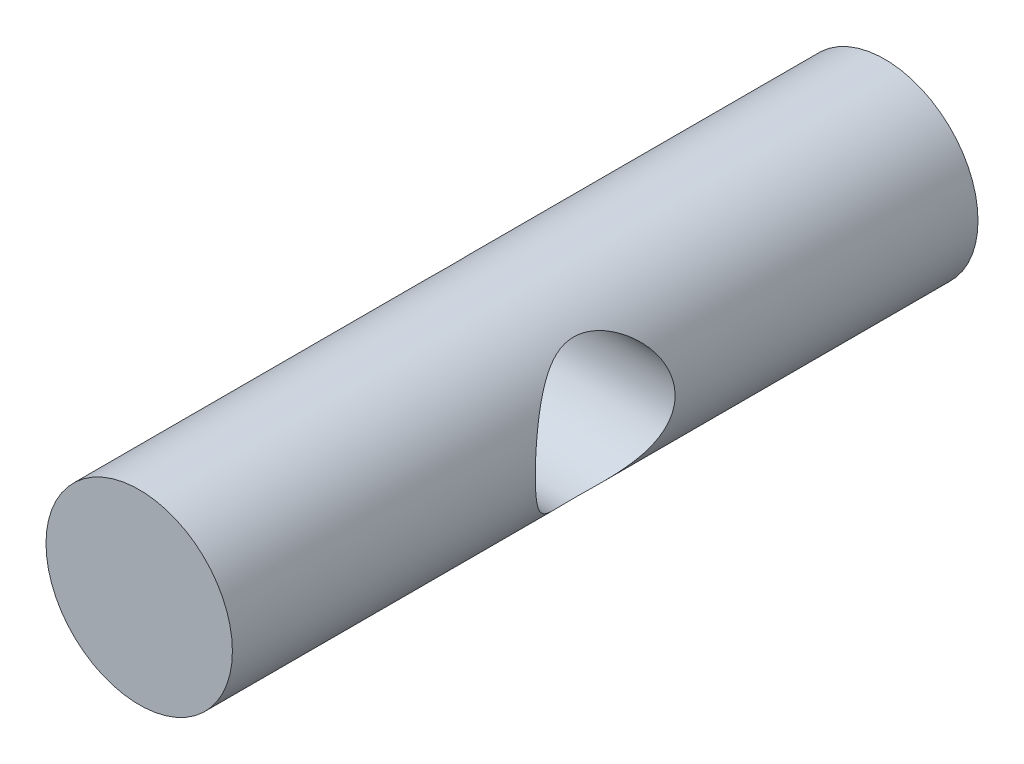
ISO-10303-21;
HEADER;
FILE_DESCRIPTION(('STEP AP214'),'2;1');
FILE_NAME('part.step','',(''),(''),'','','');
FILE_SCHEMA(('AUTOMOTIVE_DESIGN { 1 0 10303 214 1 1 1 1 }'));
ENDSEC;
DATA;
#1=APPLICATION_CONTEXT('core data for automotive mechanical design processes');
#2=APPLICATION_PROTOCOL_DEFINITION('international standard','automotive_design',2000,#1);
#3=PRODUCT_CONTEXT('',#1,'mechanical');
#4=PRODUCT('Part','Part','',(#3));
#5=PRODUCT_RELATED_PRODUCT_CATEGORY('part','',(#4));
#6=PRODUCT_DEFINITION_FORMATION('','',#4);
#7=PRODUCT_DEFINITION_CONTEXT('part definition',#1,'design');
#8=PRODUCT_DEFINITION('design','',#6,#7);
#9=PRODUCT_DEFINITION_SHAPE('','',#8);
#10=(LENGTH_UNIT() NAMED_UNIT(*) SI_UNIT(.MILLI.,.METRE.));
#11=(NAMED_UNIT(*) PLANE_ANGLE_UNIT() SI_UNIT($,.RADIAN.));
#12=(NAMED_UNIT(*) SI_UNIT($,.STERADIAN.) SOLID_ANGLE_UNIT());
#13=UNCERTAINTY_MEASURE_WITH_UNIT(LENGTH_MEASURE(1.E-05),#10,'distance_accuracy_value','');
#14=(GEOMETRIC_REPRESENTATION_CONTEXT(3) GLOBAL_UNCERTAINTY_ASSIGNED_CONTEXT((#13)) GLOBAL_UNIT_ASSIGNED_CONTEXT((#10,
#11,#12)) REPRESENTATION_CONTEXT('',''));
#15=CARTESIAN_POINT('',(0.,0.,0.));
#16=DIRECTION('',(0.,0.,1.));
#17=DIRECTION('',(1.,0.,0.));
#18=AXIS2_PLACEMENT_3D('',#15,#16,#17);
#19=CARTESIAN_POINT('',(0.,0.,80.));
#20=DIRECTION('',(0.,0.,-1.));
#21=DIRECTION('',(-1.,0.,0.));
#22=AXIS2_PLACEMENT_3D('',#19,#20,#21);
#23=CYLINDRICAL_SURFACE('',#22,10.);
#24=CARTESIAN_POINT('',(0.,0.,80.));
#25=DIRECTION('',(0.,0.,1.));
#26=DIRECTION('',(1.,0.,0.));
#27=AXIS2_PLACEMENT_3D('',#24,#25,#26);
#28=CIRCLE('',#27,10.);
#29=CARTESIAN_POINT('',(10.,0.,80.));
#30=VERTEX_POINT('',#29);
#31=EDGE_CURVE('E10',#30,#30,#28,.T.);
#32=ORIENTED_EDGE('',*,*,#31,.F.);
#33=EDGE_LOOP('',(#32));
#34=FACE_BOUND('',#33,.T.);
#35=CARTESIAN_POINT('',(0.,0.,0.));
#36=DIRECTION('',(0.,0.,1.));
#37=DIRECTION('',(1.,0.,0.));
#38=AXIS2_PLACEMENT_3D('',#35,#36,#37);
#39=CIRCLE('',#38,10.);
#40=CARTESIAN_POINT('',(10.,0.,0.));
#41=VERTEX_POINT('',#40);
#42=EDGE_CURVE('E49',#41,#41,#39,.T.);
#43=ORIENTED_EDGE('',*,*,#42,.T.);
#44=EDGE_LOOP('',(#43));
#45=FACE_BOUND('',#44,.T.);
#46=CARTESIAN_POINT('',(10.,0.,47.5));
#47=CARTESIAN_POINT('',(9.99999825220043,-0.183148360631224,47.4999981889374));
#48=CARTESIAN_POINT('',(9.99495621731441,-0.366342585140464,47.4932790435537));
#49=CARTESIAN_POINT('',(9.97490143097507,-0.731284647804647,47.4665075354722));
#50=CARTESIAN_POINT('',(9.95988271339075,-0.913031554599345,47.4464471946312));
#51=CARTESIAN_POINT('',(9.9201917868147,-1.27389276294165,47.3932752466979));
#52=CARTESIAN_POINT('',(9.89550118322144,-1.45300136929127,47.3601387696951));
#53=CARTESIAN_POINT('',(9.83702172640045,-1.8069893726824,47.2813249678357));
#54=CARTESIAN_POINT('',(9.80322881221236,-1.98186684397495,47.2356420452522));
#55=CARTESIAN_POINT('',(9.72752378128582,-2.32506995293138,47.1327363216916));
#56=CARTESIAN_POINT('',(9.6856665671512,-2.49343113760904,47.0755914524838));
#57=CARTESIAN_POINT('',(9.59451489400363,-2.82395570771372,46.9502916629176));
#58=CARTESIAN_POINT('',(9.5452174929203,-2.98611660943024,46.8821323863789));
#59=CARTESIAN_POINT('',(9.38756843011347,-3.46192400316672,46.6623521329774));
#60=CARTESIAN_POINT('',(9.26935773011459,-3.76534217699647,46.4952921574436));
#61=CARTESIAN_POINT('',(9.00247083181558,-4.36738031046614,46.1086707071509));
#62=CARTESIAN_POINT('',(8.85198712189838,-4.66295396944976,45.885680005089));
#63=CARTESIAN_POINT('',(8.53832916588274,-5.21514803427101,45.4025041354839));
#64=CARTESIAN_POINT('',(8.37513550772825,-5.47170701559805,45.1422615438788));
#65=CARTESIAN_POINT('',(8.1123054849366,-5.84983236323795,44.6986607517648));
#66=CARTESIAN_POINT('',(8.01322272061777,-5.98448699541009,44.5259238219425));
#67=CARTESIAN_POINT('',(7.81692237304354,-6.23870842573754,44.1685280702438));
#68=CARTESIAN_POINT('',(7.71970535968098,-6.35827067422418,43.9838656786204));
#69=CARTESIAN_POINT('',(7.53024443396407,-6.58155279088788,43.603028862686));
#70=CARTESIAN_POINT('',(7.43799561146134,-6.68528849377295,43.4068662202847));
#71=CARTESIAN_POINT('',(7.26194992595442,-6.87611265864527,43.0031570820878));
#72=CARTESIAN_POINT('',(7.17814826410122,-6.96321059804277,42.7956171544029));
#73=CARTESIAN_POINT('',(6.99885956719935,-7.14400878104046,42.3025464523882));
#74=CARTESIAN_POINT('',(6.9078729915952,-7.23130376139035,42.0128709819946));
#75=CARTESIAN_POINT('',(6.79582705692467,-7.33616747091051,41.5665302760464));
#76=CARTESIAN_POINT('',(6.7625626495277,-7.36676563602348,41.4158673133472));
#77=CARTESIAN_POINT('',(6.70541097180997,-7.41882486802788,41.1112483315377));
#78=CARTESIAN_POINT('',(6.68151886959137,-7.44029064361234,40.9572940525537));
#79=CARTESIAN_POINT('',(6.64399487351841,-7.4738195774795,40.6456153273307));
#80=CARTESIAN_POINT('',(6.63046224230684,-7.48579180837431,40.4878689878931));
#81=CARTESIAN_POINT('',(6.61471013710175,-7.49971481213819,40.1713664228761));
#82=CARTESIAN_POINT('',(6.61249035269244,-7.50166585998078,40.0126102251262));
#83=CARTESIAN_POINT('',(6.61948621008001,-7.49549374588534,39.6954929541917));
#84=CARTESIAN_POINT('',(6.62870559451458,-7.48736728681514,39.5371320273203));
#85=CARTESIAN_POINT('',(6.65809333447629,-7.46124382754021,39.2222932055966));
#86=CARTESIAN_POINT('',(6.6782618015552,-7.44324672677111,39.065815329946));
#87=CARTESIAN_POINT('',(6.74840995476556,-7.37988631197293,38.6342503129904));
#88=CARTESIAN_POINT('',(6.80936438102532,-7.32413018954155,38.3623944329782));
#89=CARTESIAN_POINT('',(6.95570310792852,-7.18527767988214,37.8327292447162));
#90=CARTESIAN_POINT('',(7.04111087930064,-7.10215501424415,37.5749337161969));
#91=CARTESIAN_POINT('',(7.21099153900677,-6.92917382263755,37.1218305167386));
#92=CARTESIAN_POINT('',(7.29266351327928,-6.84346833605325,36.9238405761359));
#93=CARTESIAN_POINT('',(7.46342165901279,-6.65682611972849,36.5384190168799));
#94=CARTESIAN_POINT('',(7.55251162228971,-6.55588157861578,36.3509928811768));
#95=CARTESIAN_POINT('',(7.73517823120313,-6.33933222593356,35.9865361640151));
#96=CARTESIAN_POINT('',(7.82876380678446,-6.22369741624747,35.8095279702705));
#97=CARTESIAN_POINT('',(8.01761553681547,-5.97844426893635,35.4664971158473));
#98=CARTESIAN_POINT('',(8.11288142581883,-5.84882812374302,35.3004727393501));
#99=CARTESIAN_POINT('',(8.30521453319946,-5.57247402890015,34.975645048084));
#100=CARTESIAN_POINT('',(8.40226649936021,-5.42538639972571,34.8171299047616));
#101=CARTESIAN_POINT('',(8.5935031315706,-5.11709028531975,34.5125287068656));
#102=CARTESIAN_POINT('',(8.68768750660852,-4.95588037331081,34.3664439110788));
#103=CARTESIAN_POINT('',(8.87089324795422,-4.61993509999966,34.0878314184192));
#104=CARTESIAN_POINT('',(8.9599230830712,-4.44522309293499,33.9552811940493));
#105=CARTESIAN_POINT('',(9.13090472642982,-4.0824934348789,33.7046195018473));
#106=CARTESIAN_POINT('',(9.21285834099645,-3.89447920193418,33.5865043460028));
#107=CARTESIAN_POINT('',(9.35211813533671,-3.54483535127364,33.3881893774522));
#108=CARTESIAN_POINT('',(9.41107137526017,-3.3854749988014,33.3051360212074));
#109=CARTESIAN_POINT('',(9.52211460031246,-3.05924910859919,33.1499191215818));
#110=CARTESIAN_POINT('',(9.57420599638373,-2.89238512327235,33.0777533390372));
#111=CARTESIAN_POINT('',(9.67052015896568,-2.55192522953366,32.9451409236695));
#112=CARTESIAN_POINT('',(9.71474587063951,-2.37833187059298,32.8846899037026));
#113=CARTESIAN_POINT('',(9.7944303324846,-2.02530797337889,32.7762740016175));
#114=CARTESIAN_POINT('',(9.82988897006303,-1.84587736017292,32.7283092798566));
#115=CARTESIAN_POINT('',(9.89142668215868,-1.48124003999791,32.6453346771726));
#116=CARTESIAN_POINT('',(9.91744578882848,-1.29600425567115,32.6104075830867));
#117=CARTESIAN_POINT('',(9.95915423278582,-0.922276966538736,32.554524893669));
#118=CARTESIAN_POINT('',(9.97484354492046,-0.733785453806579,32.5335693323576));
#119=CARTESIAN_POINT('',(9.99548555303477,-0.355230498112978,32.5060147552589));
#120=CARTESIAN_POINT('',(10.0004418293711,-0.165167600582664,32.4994109519686));
#121=CARTESIAN_POINT('',(9.99949640206274,0.214874139571324,32.5006714062232));
#122=CARTESIAN_POINT('',(9.99359555401241,0.40485298763842,32.5085345237041));
#123=CARTESIAN_POINT('',(9.97223305994797,0.763928127056929,32.5370576302621));
#124=CARTESIAN_POINT('',(9.95779618888371,0.933197305435492,32.5563463419927));
#125=CARTESIAN_POINT('',(9.92057133553495,1.26918880187072,32.606218049516));
#126=CARTESIAN_POINT('',(9.89778056893783,1.43591025146062,32.6368048109199));
#127=CARTESIAN_POINT('',(9.84430767733922,1.76564432096826,32.7088426505787));
#128=CARTESIAN_POINT('',(9.81362747999547,1.92865783628606,32.7502910750048));
#129=CARTESIAN_POINT('',(9.74493618777163,2.2501682264863,32.8435500772852));
#130=CARTESIAN_POINT('',(9.70692222377835,2.40866330572277,32.8953647108982));
#131=CARTESIAN_POINT('',(9.62279034107677,2.72575422161848,33.0107433563643));
#132=CARTESIAN_POINT('',(9.57643622072002,2.88416117889077,33.0746538258923));
#133=CARTESIAN_POINT('',(9.47738924248976,3.19463271777295,33.2122770509072));
#134=CARTESIAN_POINT('',(9.42469423001767,3.34669511976836,33.285993139189));
#135=CARTESIAN_POINT('',(9.25839398463923,3.79243668836606,33.5207930758232));
#136=CARTESIAN_POINT('',(9.13650809547068,4.07590942242921,33.6956169701555));
#137=CARTESIAN_POINT('',(8.855926898612,4.65763303463208,34.1089611242663));
#138=CARTESIAN_POINT('',(8.69448369509785,4.95044606090117,34.3532430155336));
#139=CARTESIAN_POINT('',(8.44516881462102,5.35767107336567,34.7482147034281));
#140=CARTESIAN_POINT('',(8.36074234741944,5.4882491820926,34.8848527858376));
#141=CARTESIAN_POINT('',(8.19100904652955,5.7384834596805,35.1672592877294));
#142=CARTESIAN_POINT('',(8.1057024263051,5.85814221058998,35.3130255348992));
#143=CARTESIAN_POINT('',(7.91961196391862,6.1080614484982,35.6420163996148));
#144=CARTESIAN_POINT('',(7.81897317293293,6.23600392340882,35.8270894234011));
#145=CARTESIAN_POINT('',(7.62168627596285,6.47564568677309,36.2096220476519));
#146=CARTESIAN_POINT('',(7.52503964549598,6.58733900727103,36.4070861611693));
#147=CARTESIAN_POINT('',(7.33958950470875,6.79334858159908,36.8137398557131));
#148=CARTESIAN_POINT('',(7.25076782174859,6.88770568215121,37.0229003198852));
#149=CARTESIAN_POINT('',(7.08503810393456,7.05807032553021,37.453031280932));
#150=CARTESIAN_POINT('',(7.00812021113291,7.13409308112477,37.6739917995539));
#151=CARTESIAN_POINT('',(6.89776536900087,7.24045739920368,38.0387365799028));
#152=CARTESIAN_POINT('',(6.85905105065738,7.27706722475707,38.179121350578));
#153=CARTESIAN_POINT('',(6.78909215619301,7.34237828490353,38.4635265676929));
#154=CARTESIAN_POINT('',(6.75784495867727,7.37108229544015,38.607545718565));
#155=CARTESIAN_POINT('',(6.70397772845789,7.42010866141178,38.8983271464417));
#156=CARTESIAN_POINT('',(6.68134175721603,7.4404465075322,39.0450838229389));
#157=CARTESIAN_POINT('',(6.64553659947693,7.47244433482206,39.3407022122691));
#158=CARTESIAN_POINT('',(6.63236743689916,7.48410429406539,39.48956393042));
#159=CARTESIAN_POINT('',(6.61604392687071,7.49853887636308,39.7890456134731));
#160=CARTESIAN_POINT('',(6.61294157310429,7.5012673702604,39.939670686664));
#161=CARTESIAN_POINT('',(6.61704410383111,7.49764855771467,40.2406650710012));
#162=CARTESIAN_POINT('',(6.6242487717127,7.491301442004,40.3910343874559));
#163=CARTESIAN_POINT('',(6.64864042221955,7.46966150960367,40.69044033884));
#164=CARTESIAN_POINT('',(6.66583653866429,7.45436050750457,40.8394756274997));
#165=CARTESIAN_POINT('',(6.70947271822503,7.41510828933917,41.1350870372553));
#166=CARTESIAN_POINT('',(6.73591768435148,7.39115248495673,41.281661810703));
#167=CARTESIAN_POINT('',(6.80366991769713,7.32888993758964,41.6030185630502));
#168=CARTESIAN_POINT('',(6.84695911424574,7.28859466709028,41.7769975614515));
#169=CARTESIAN_POINT('',(6.94360749633832,7.19657956576836,42.1191194152513));
#170=CARTESIAN_POINT('',(6.99697427787176,7.14485111212704,42.2872577543234));
#171=CARTESIAN_POINT('',(7.11173285585202,7.03063417120002,42.6173948444318));
#172=CARTESIAN_POINT('',(7.17314049085418,6.96812436806886,42.7793806420008));
#173=CARTESIAN_POINT('',(7.30189696957416,6.83308175773697,43.0965626417457));
#174=CARTESIAN_POINT('',(7.36924400073342,6.76055200457875,43.2517608938347));
#175=CARTESIAN_POINT('',(7.53227527340475,6.57908862155702,43.6080855923601));
#176=CARTESIAN_POINT('',(7.62967949604614,6.46625899136203,43.8064489596901));
#177=CARTESIAN_POINT('',(7.82848797542238,6.22409397674893,44.1907343917703));
#178=CARTESIAN_POINT('',(7.92989347166993,6.09475344941422,44.3766525523867));
#179=CARTESIAN_POINT('',(8.13368678615596,5.82000166017292,44.7358998175134));
#180=CARTESIAN_POINT('',(8.23607528693575,5.67457836362909,44.9092193316068));
#181=CARTESIAN_POINT('',(8.43902615179917,5.36811116429771,45.2425789323651));
#182=CARTESIAN_POINT('',(8.53958873605844,5.20706915992245,45.4026206285367));
#183=CARTESIAN_POINT('',(8.73722404742755,4.86823444610667,45.7099065721763));
#184=CARTESIAN_POINT('',(8.83426032912376,4.69031229919782,45.8570319241357));
#185=CARTESIAN_POINT('',(9.02148209885813,4.31926384766125,46.1357799917969));
#186=CARTESIAN_POINT('',(9.11166669061666,4.12613556060168,46.2674006805464));
#187=CARTESIAN_POINT('',(9.28256253574139,3.72576429558787,46.5133531652643));
#188=CARTESIAN_POINT('',(9.36329167565035,3.51854917893226,46.6277177262155));
#189=CARTESIAN_POINT('',(9.51304471510834,3.09083237545736,46.8376480517731));
#190=CARTESIAN_POINT('',(9.5820746530538,2.87033762289902,46.9332235182347));
#191=CARTESIAN_POINT('',(9.68796526126722,2.48412405824608,47.0787264227465));
#192=CARTESIAN_POINT('',(9.72832482945904,2.32129005811085,47.1338229914882));
#193=CARTESIAN_POINT('',(9.80132549603498,1.99064201184581,47.2330570398299));
#194=CARTESIAN_POINT('',(9.83396846856479,1.82282918610054,47.277197180571));
#195=CARTESIAN_POINT('',(9.89082818213226,1.48358839494541,47.3538520954768));
#196=CARTESIAN_POINT('',(9.91506439962452,1.31216977477247,47.3863937454765));
#197=CARTESIAN_POINT('',(9.95469855719796,0.96654040133809,47.4395119589965));
#198=CARTESIAN_POINT('',(9.9701010169854,0.792331122875274,47.4600946412769));
#199=CARTESIAN_POINT('',(9.98726751877774,0.514835906933095,47.483016801583));
#200=CARTESIAN_POINT('',(9.99203792739739,0.412044960462383,47.4893811518671));
#201=CARTESIAN_POINT('',(9.9984049153868,0.206174215981064,47.4978736017728));
#202=CARTESIAN_POINT('',(10.0000009838379,0.103094374145228,47.5000010194487));
#203=CARTESIAN_POINT('',(10.,0.,47.5));
#204=B_SPLINE_CURVE_WITH_KNOTS('',3,(#46,#47,#48,#49,#50,#51,#52,#53,#54,#55,#56,#57,#58,#59,
#60,#61,#62,#63,#64,#65,#66,#67,#68,#69,#70,#71,#72,#73,#74,#75,#76,#77,#78,#79,#80,#81,#82,#83,
#84,#85,#86,#87,#88,#89,#90,#91,#92,#93,#94,#95,#96,#97,#98,#99,#100,#101,#102,#103,#104,#105,
#106,#107,#108,#109,#110,#111,#112,#113,#114,#115,#116,#117,#118,#119,#120,#121,#122,#123,#124,
#125,#126,#127,#128,#129,#130,#131,#132,#133,#134,#135,#136,#137,#138,#139,#140,#141,#142,#143,
#144,#145,#146,#147,#148,#149,#150,#151,#152,#153,#154,#155,#156,#157,#158,#159,#160,#161,#162,
#163,#164,#165,#166,#167,#168,#169,#170,#171,#172,#173,#174,#175,#176,#177,#178,#179,#180,#181,
#182,#183,#184,#185,#186,#187,#188,#189,#190,#191,#192,#193,#194,#195,#196,#197,#198,#199,#200,
#201,#202,#203),.UNSPECIFIED.,.T.,.F.,(4,2,2,2,2,2,2,2,2,2,2,2,2,2,2,2,2,2,2,2,2,2,2,2,2,2,2,2,
2,2,2,2,2,2,2,2,2,2,2,2,2,2,2,2,2,2,2,2,2,2,2,2,2,2,2,2,2,2,2,2,2,2,2,2,2,2,2,2,2,2,2,2,2,2,2,2,
2,2,4),(0.,0.549333810396349,1.09899642261334,1.64970953325451,2.20066875053375,
2.74800168216963,3.29555161528971,4.38923194166926,5.58419151329428,6.78101336768092,
7.50152042078937,8.22224415798695,8.94224200290019,9.66182848258839,10.6057257062582,
11.0771415311411,11.5483139968762,12.0239465220089,12.4995659960823,12.9753411231469,
13.4511210976087,14.3000658907337,15.1498282626302,15.8409837223713,16.5324946713612,
17.2254411215001,17.9182790673241,18.6286106705283,19.3390141216436,20.0482151836289,
20.7572346715093,21.3240789510858,21.8908064927599,22.4573213847599,23.0238435519584,
23.5939042031105,24.163966242347,24.733838089351,25.3036650295946,25.8159956353881,
26.3284971539712,26.8408735696906,27.3534508450853,27.8838865184232,28.4145029424249,
29.4749536671179,30.7125000722884,31.3331067040452,31.9535662015579,32.6921380168985,
33.4309804122227,34.168059012369,34.9045239072426,35.3546199278826,35.804557705681,
36.2536585931601,36.7027606153632,37.1541785263257,37.6055869504596,38.0574086864992,
38.5094703067445,39.0599080061886,39.6107622667341,40.1627183763172,40.7145066214401,
41.457880510944,42.2014865187519,42.9456527762346,43.6897286953817,44.440059867972,
45.1904890240893,45.9394748739468,46.6880729590086,47.2172824489513,47.7463632763238,
48.2742100312628,48.801786477061,49.1109572068325,49.4201776944439),.UNSPECIFIED.);
#205=CARTESIAN_POINT('',(10.,0.,47.5));
#206=VERTEX_POINT('',#205);
#207=EDGE_CURVE('E55',#206,#206,#204,.T.);
#208=ORIENTED_EDGE('',*,*,#207,.F.);
#209=EDGE_LOOP('',(#208));
#210=FACE_BOUND('',#209,.T.);
#211=CARTESIAN_POINT('',(-10.,0.,47.5));
#212=CARTESIAN_POINT('',(-9.99999825220043,0.183148360631224,47.4999981889374));
#213=CARTESIAN_POINT('',(-9.99495621731441,0.366342585140464,47.4932790435537));
#214=CARTESIAN_POINT('',(-9.97490143097507,0.731284647804647,47.4665075354722));
#215=CARTESIAN_POINT('',(-9.95988271339075,0.913031554599345,47.4464471946312));
#216=CARTESIAN_POINT('',(-9.9201917868147,1.27389276294165,47.3932752466979));
#217=CARTESIAN_POINT('',(-9.89550118322144,1.45300136929127,47.3601387696951));
#218=CARTESIAN_POINT('',(-9.83702172640045,1.8069893726824,47.2813249678357));
#219=CARTESIAN_POINT('',(-9.80322881221236,1.98186684397495,47.2356420452522));
#220=CARTESIAN_POINT('',(-9.72752378128582,2.32506995293138,47.1327363216916));
#221=CARTESIAN_POINT('',(-9.6856665671512,2.49343113760904,47.0755914524838));
#222=CARTESIAN_POINT('',(-9.59451489400363,2.82395570771372,46.9502916629176));
#223=CARTESIAN_POINT('',(-9.5452174929203,2.98611660943024,46.8821323863789));
#224=CARTESIAN_POINT('',(-9.38756843011347,3.46192400316672,46.6623521329774));
#225=CARTESIAN_POINT('',(-9.26935773011459,3.76534217699647,46.4952921574436));
#226=CARTESIAN_POINT('',(-9.00247083181558,4.36738031046614,46.1086707071509));
#227=CARTESIAN_POINT('',(-8.85198712189838,4.66295396944976,45.885680005089));
#228=CARTESIAN_POINT('',(-8.53832916588274,5.21514803427101,45.4025041354839));
#229=CARTESIAN_POINT('',(-8.37513550772825,5.47170701559805,45.1422615438788));
#230=CARTESIAN_POINT('',(-8.1123054849366,5.84983236323795,44.6986607517648));
#231=CARTESIAN_POINT('',(-8.01322272061777,5.98448699541009,44.5259238219425));
#232=CARTESIAN_POINT('',(-7.81692237304354,6.23870842573754,44.1685280702438));
#233=CARTESIAN_POINT('',(-7.71970535968098,6.35827067422418,43.9838656786204));
#234=CARTESIAN_POINT('',(-7.53024443396407,6.58155279088788,43.603028862686));
#235=CARTESIAN_POINT('',(-7.43799561146134,6.68528849377295,43.4068662202847));
#236=CARTESIAN_POINT('',(-7.26194992595442,6.87611265864527,43.0031570820878));
#237=CARTESIAN_POINT('',(-7.17814826410122,6.96321059804277,42.7956171544029));
#238=CARTESIAN_POINT('',(-6.99885956719935,7.14400878104046,42.3025464523882));
#239=CARTESIAN_POINT('',(-6.9078729915952,7.23130376139035,42.0128709819946));
#240=CARTESIAN_POINT('',(-6.79582705692467,7.33616747091051,41.5665302760464));
#241=CARTESIAN_POINT('',(-6.7625626495277,7.36676563602348,41.4158673133472));
#242=CARTESIAN_POINT('',(-6.70541097180997,7.41882486802788,41.1112483315377));
#243=CARTESIAN_POINT('',(-6.68151886959137,7.44029064361234,40.9572940525537));
#244=CARTESIAN_POINT('',(-6.64399487351841,7.4738195774795,40.6456153273307));
#245=CARTESIAN_POINT('',(-6.63046224230684,7.48579180837431,40.4878689878931));
#246=CARTESIAN_POINT('',(-6.61471013710175,7.49971481213819,40.1713664228761));
#247=CARTESIAN_POINT('',(-6.61249035269244,7.50166585998078,40.0126102251262));
#248=CARTESIAN_POINT('',(-6.61948621008001,7.49549374588534,39.6954929541917));
#249=CARTESIAN_POINT('',(-6.62870559451458,7.48736728681514,39.5371320273203));
#250=CARTESIAN_POINT('',(-6.65809333447629,7.46124382754021,39.2222932055966));
#251=CARTESIAN_POINT('',(-6.6782618015552,7.44324672677111,39.065815329946));
#252=CARTESIAN_POINT('',(-6.74840995476556,7.37988631197293,38.6342503129904));
#253=CARTESIAN_POINT('',(-6.80936438102532,7.32413018954155,38.3623944329782));
#254=CARTESIAN_POINT('',(-6.95570310792852,7.18527767988214,37.8327292447162));
#255=CARTESIAN_POINT('',(-7.04111087930064,7.10215501424415,37.5749337161969));
#256=CARTESIAN_POINT('',(-7.21099153900677,6.92917382263755,37.1218305167386));
#257=CARTESIAN_POINT('',(-7.29266351327928,6.84346833605325,36.9238405761359));
#258=CARTESIAN_POINT('',(-7.46342165901279,6.65682611972849,36.5384190168799));
#259=CARTESIAN_POINT('',(-7.55251162228971,6.55588157861578,36.3509928811768));
#260=CARTESIAN_POINT('',(-7.73517823120313,6.33933222593356,35.9865361640151));
#261=CARTESIAN_POINT('',(-7.82876380678446,6.22369741624747,35.8095279702705));
#262=CARTESIAN_POINT('',(-8.01761553681547,5.97844426893635,35.4664971158473));
#263=CARTESIAN_POINT('',(-8.11288142581883,5.84882812374302,35.3004727393501));
#264=CARTESIAN_POINT('',(-8.30521453319946,5.57247402890015,34.975645048084));
#265=CARTESIAN_POINT('',(-8.40226649936021,5.42538639972571,34.8171299047616));
#266=CARTESIAN_POINT('',(-8.5935031315706,5.11709028531975,34.5125287068656));
#267=CARTESIAN_POINT('',(-8.68768750660852,4.95588037331081,34.3664439110788));
#268=CARTESIAN_POINT('',(-8.87089324795422,4.61993509999966,34.0878314184192));
#269=CARTESIAN_POINT('',(-8.9599230830712,4.44522309293499,33.9552811940493));
#270=CARTESIAN_POINT('',(-9.13090472642982,4.0824934348789,33.7046195018473));
#271=CARTESIAN_POINT('',(-9.21285834099645,3.89447920193418,33.5865043460028));
#272=CARTESIAN_POINT('',(-9.35211813533671,3.54483535127364,33.3881893774522));
#273=CARTESIAN_POINT('',(-9.41107137526017,3.3854749988014,33.3051360212074));
#274=CARTESIAN_POINT('',(-9.52211460031246,3.05924910859919,33.1499191215818));
#275=CARTESIAN_POINT('',(-9.57420599638373,2.89238512327235,33.0777533390372));
#276=CARTESIAN_POINT('',(-9.67052015896568,2.55192522953366,32.9451409236695));
#277=CARTESIAN_POINT('',(-9.71474587063951,2.37833187059298,32.8846899037026));
#278=CARTESIAN_POINT('',(-9.7944303324846,2.02530797337889,32.7762740016175));
#279=CARTESIAN_POINT('',(-9.82988897006303,1.84587736017292,32.7283092798566));
#280=CARTESIAN_POINT('',(-9.89142668215868,1.48124003999791,32.6453346771726));
#281=CARTESIAN_POINT('',(-9.91744578882848,1.29600425567115,32.6104075830867));
#282=CARTESIAN_POINT('',(-9.95915423278582,0.922276966538736,32.554524893669));
#283=CARTESIAN_POINT('',(-9.97484354492046,0.733785453806579,32.5335693323576));
#284=CARTESIAN_POINT('',(-9.99548555303477,0.355230498112978,32.5060147552589));
#285=CARTESIAN_POINT('',(-10.0004418293711,0.165167600582664,32.4994109519686));
#286=CARTESIAN_POINT('',(-9.99949640206274,-0.214874139571324,32.5006714062232));
#287=CARTESIAN_POINT('',(-9.99359555401241,-0.40485298763842,32.5085345237041));
#288=CARTESIAN_POINT('',(-9.97223305994797,-0.763928127056929,32.5370576302621));
#289=CARTESIAN_POINT('',(-9.95779618888371,-0.933197305435492,32.5563463419927));
#290=CARTESIAN_POINT('',(-9.92057133553495,-1.26918880187072,32.606218049516));
#291=CARTESIAN_POINT('',(-9.89778056893783,-1.43591025146062,32.6368048109199));
#292=CARTESIAN_POINT('',(-9.84430767733922,-1.76564432096826,32.7088426505787));
#293=CARTESIAN_POINT('',(-9.81362747999547,-1.92865783628606,32.7502910750048));
#294=CARTESIAN_POINT('',(-9.74493618777163,-2.2501682264863,32.8435500772852));
#295=CARTESIAN_POINT('',(-9.70692222377835,-2.40866330572277,32.8953647108982));
#296=CARTESIAN_POINT('',(-9.62279034107677,-2.72575422161848,33.0107433563643));
#297=CARTESIAN_POINT('',(-9.57643622072002,-2.88416117889077,33.0746538258923));
#298=CARTESIAN_POINT('',(-9.47738924248976,-3.19463271777295,33.2122770509072));
#299=CARTESIAN_POINT('',(-9.42469423001767,-3.34669511976836,33.285993139189));
#300=CARTESIAN_POINT('',(-9.25839398463923,-3.79243668836606,33.5207930758232));
#301=CARTESIAN_POINT('',(-9.13650809547068,-4.07590942242921,33.6956169701555));
#302=CARTESIAN_POINT('',(-8.855926898612,-4.65763303463208,34.1089611242663));
#303=CARTESIAN_POINT('',(-8.69448369509785,-4.95044606090117,34.3532430155336));
#304=CARTESIAN_POINT('',(-8.44516881462102,-5.35767107336567,34.7482147034281));
#305=CARTESIAN_POINT('',(-8.36074234741944,-5.4882491820926,34.8848527858376));
#306=CARTESIAN_POINT('',(-8.19100904652955,-5.7384834596805,35.1672592877294));
#307=CARTESIAN_POINT('',(-8.1057024263051,-5.85814221058998,35.3130255348992));
#308=CARTESIAN_POINT('',(-7.91961196391862,-6.1080614484982,35.6420163996148));
#309=CARTESIAN_POINT('',(-7.81897317293293,-6.23600392340882,35.8270894234011));
#310=CARTESIAN_POINT('',(-7.62168627596285,-6.47564568677309,36.2096220476519));
#311=CARTESIAN_POINT('',(-7.52503964549598,-6.58733900727103,36.4070861611693));
#312=CARTESIAN_POINT('',(-7.33958950470875,-6.79334858159908,36.8137398557131));
#313=CARTESIAN_POINT('',(-7.25076782174859,-6.88770568215121,37.0229003198852));
#314=CARTESIAN_POINT('',(-7.08503810393456,-7.05807032553021,37.453031280932));
#315=CARTESIAN_POINT('',(-7.00812021113291,-7.13409308112477,37.6739917995539));
#316=CARTESIAN_POINT('',(-6.89776536900087,-7.24045739920368,38.0387365799028));
#317=CARTESIAN_POINT('',(-6.85905105065738,-7.27706722475707,38.179121350578));
#318=CARTESIAN_POINT('',(-6.78909215619301,-7.34237828490353,38.4635265676929));
#319=CARTESIAN_POINT('',(-6.75784495867727,-7.37108229544015,38.607545718565));
#320=CARTESIAN_POINT('',(-6.70397772845789,-7.42010866141178,38.8983271464417));
#321=CARTESIAN_POINT('',(-6.68134175721603,-7.4404465075322,39.0450838229389));
#322=CARTESIAN_POINT('',(-6.64553659947693,-7.47244433482206,39.3407022122691));
#323=CARTESIAN_POINT('',(-6.63236743689916,-7.48410429406539,39.48956393042));
#324=CARTESIAN_POINT('',(-6.61604392687071,-7.49853887636308,39.7890456134731));
#325=CARTESIAN_POINT('',(-6.61294157310429,-7.5012673702604,39.939670686664));
#326=CARTESIAN_POINT('',(-6.61704410383111,-7.49764855771467,40.2406650710012));
#327=CARTESIAN_POINT('',(-6.6242487717127,-7.491301442004,40.3910343874559));
#328=CARTESIAN_POINT('',(-6.64864042221955,-7.46966150960367,40.69044033884));
#329=CARTESIAN_POINT('',(-6.66583653866429,-7.45436050750457,40.8394756274997));
#330=CARTESIAN_POINT('',(-6.70947271822503,-7.41510828933917,41.1350870372553));
#331=CARTESIAN_POINT('',(-6.73591768435148,-7.39115248495673,41.281661810703));
#332=CARTESIAN_POINT('',(-6.80366991769713,-7.32888993758964,41.6030185630502));
#333=CARTESIAN_POINT('',(-6.84695911424574,-7.28859466709028,41.7769975614515));
#334=CARTESIAN_POINT('',(-6.94360749633832,-7.19657956576836,42.1191194152513));
#335=CARTESIAN_POINT('',(-6.99697427787176,-7.14485111212704,42.2872577543234));
#336=CARTESIAN_POINT('',(-7.11173285585202,-7.03063417120002,42.6173948444318));
#337=CARTESIAN_POINT('',(-7.17314049085418,-6.96812436806886,42.7793806420008));
#338=CARTESIAN_POINT('',(-7.30189696957416,-6.83308175773697,43.0965626417457));
#339=CARTESIAN_POINT('',(-7.36924400073342,-6.76055200457875,43.2517608938347));
#340=CARTESIAN_POINT('',(-7.53227527340475,-6.57908862155702,43.6080855923601));
#341=CARTESIAN_POINT('',(-7.62967949604614,-6.46625899136203,43.8064489596901));
#342=CARTESIAN_POINT('',(-7.82848797542238,-6.22409397674893,44.1907343917703));
#343=CARTESIAN_POINT('',(-7.92989347166993,-6.09475344941422,44.3766525523867));
#344=CARTESIAN_POINT('',(-8.13368678615596,-5.82000166017292,44.7358998175134));
#345=CARTESIAN_POINT('',(-8.23607528693575,-5.67457836362909,44.9092193316068));
#346=CARTESIAN_POINT('',(-8.43902615179917,-5.36811116429771,45.2425789323651));
#347=CARTESIAN_POINT('',(-8.53958873605844,-5.20706915992245,45.4026206285367));
#348=CARTESIAN_POINT('',(-8.73722404742755,-4.86823444610667,45.7099065721763));
#349=CARTESIAN_POINT('',(-8.83426032912376,-4.69031229919782,45.8570319241357));
#350=CARTESIAN_POINT('',(-9.02148209885813,-4.31926384766125,46.1357799917969));
#351=CARTESIAN_POINT('',(-9.11166669061666,-4.12613556060168,46.2674006805464));
#352=CARTESIAN_POINT('',(-9.28256253574139,-3.72576429558787,46.5133531652643));
#353=CARTESIAN_POINT('',(-9.36329167565035,-3.51854917893226,46.6277177262155));
#354=CARTESIAN_POINT('',(-9.51304471510834,-3.09083237545736,46.8376480517731));
#355=CARTESIAN_POINT('',(-9.5820746530538,-2.87033762289902,46.9332235182347));
#356=CARTESIAN_POINT('',(-9.68796526126722,-2.48412405824608,47.0787264227465));
#357=CARTESIAN_POINT('',(-9.72832482945904,-2.32129005811085,47.1338229914882));
#358=CARTESIAN_POINT('',(-9.80132549603498,-1.99064201184581,47.2330570398299));
#359=CARTESIAN_POINT('',(-9.83396846856479,-1.82282918610054,47.277197180571));
#360=CARTESIAN_POINT('',(-9.89082818213226,-1.48358839494541,47.3538520954768));
#361=CARTESIAN_POINT('',(-9.91506439962452,-1.31216977477247,47.3863937454765));
#362=CARTESIAN_POINT('',(-9.95469855719796,-0.96654040133809,47.4395119589965));
#363=CARTESIAN_POINT('',(-9.9701010169854,-0.792331122875274,47.4600946412769));
#364=CARTESIAN_POINT('',(-9.98726751877774,-0.514835906933095,47.483016801583));
#365=CARTESIAN_POINT('',(-9.99203792739739,-0.412044960462383,47.4893811518671));
#366=CARTESIAN_POINT('',(-9.9984049153868,-0.206174215981064,47.4978736017728));
#367=CARTESIAN_POINT('',(-10.0000009838379,-0.103094374145228,47.5000010194487));
#368=CARTESIAN_POINT('',(-10.,0.,47.5));
#369=B_SPLINE_CURVE_WITH_KNOTS('',3,(#211,#212,#213,#214,#215,#216,#217,#218,#219,#220,#221,
#222,#223,#224,#225,#226,#227,#228,#229,#230,#231,#232,#233,#234,#235,#236,#237,#238,#239,#240,
#241,#242,#243,#244,#245,#246,#247,#248,#249,#250,#251,#252,#253,#254,#255,#256,#257,#258,#259,
#260,#261,#262,#263,#264,#265,#266,#267,#268,#269,#270,#271,#272,#273,#274,#275,#276,#277,#278,
#279,#280,#281,#282,#283,#284,#285,#286,#287,#288,#289,#290,#291,#292,#293,#294,#295,#296,#297,
#298,#299,#300,#301,#302,#303,#304,#305,#306,#307,#308,#309,#310,#311,#312,#313,#314,#315,#316,
#317,#318,#319,#320,#321,#322,#323,#324,#325,#326,#327,#328,#329,#330,#331,#332,#333,#334,#335,
#336,#337,#338,#339,#340,#341,#342,#343,#344,#345,#346,#347,#348,#349,#350,#351,#352,#353,#354,
#355,#356,#357,#358,#359,#360,#361,#362,#363,#364,#365,#366,#367,#368),.UNSPECIFIED.,.T.,.F.,(4,
2,2,2,2,2,2,2,2,2,2,2,2,2,2,2,2,2,2,2,2,2,2,2,2,2,2,2,2,2,2,2,2,2,2,2,2,2,2,2,2,2,2,2,2,2,2,2,2,
2,2,2,2,2,2,2,2,2,2,2,2,2,2,2,2,2,2,2,2,2,2,2,2,2,2,2,2,2,4),(0.,0.549333810396349,
1.09899642261334,1.64970953325451,2.20066875053375,2.74800168216963,3.29555161528971,
4.38923194166926,5.58419151329428,6.78101336768092,7.50152042078937,8.22224415798695,
8.94224200290019,9.66182848258839,10.6057257062582,11.0771415311411,11.5483139968762,
12.0239465220089,12.4995659960823,12.9753411231469,13.4511210976087,14.3000658907337,
15.1498282626302,15.8409837223713,16.5324946713612,17.2254411215001,17.9182790673241,
18.6286106705283,19.3390141216436,20.0482151836289,20.7572346715093,21.3240789510858,
21.8908064927599,22.4573213847599,23.0238435519584,23.5939042031105,24.163966242347,
24.733838089351,25.3036650295946,25.8159956353881,26.3284971539712,26.8408735696906,
27.3534508450853,27.8838865184232,28.4145029424249,29.4749536671179,30.7125000722884,
31.3331067040452,31.9535662015579,32.6921380168985,33.4309804122227,34.168059012369,
34.9045239072426,35.3546199278826,35.804557705681,36.2536585931601,36.7027606153632,
37.1541785263257,37.6055869504596,38.0574086864992,38.5094703067445,39.0599080061886,
39.6107622667341,40.1627183763172,40.7145066214401,41.457880510944,42.2014865187519,
42.9456527762346,43.6897286953817,44.440059867972,45.1904890240893,45.9394748739468,
46.6880729590086,47.2172824489513,47.7463632763238,48.2742100312628,48.801786477061,
49.1109572068325,49.4201776944439),.UNSPECIFIED.);
#370=CARTESIAN_POINT('',(-10.,0.,47.5));
#371=VERTEX_POINT('',#370);
#372=EDGE_CURVE('E41',#371,#371,#369,.T.);
#373=ORIENTED_EDGE('',*,*,#372,.F.);
#374=EDGE_LOOP('',(#373));
#375=FACE_BOUND('',#374,.T.);
#376=ADVANCED_FACE('F37',(#34,#45,#210,#375),#23,.T.);
#377=CARTESIAN_POINT('',(0.,0.,80.));
#378=DIRECTION('',(0.,0.,1.));
#379=DIRECTION('',(1.,0.,0.));
#380=AXIS2_PLACEMENT_3D('',#377,#378,#379);
#381=PLANE('',#380);
#382=ORIENTED_EDGE('',*,*,#31,.T.);
#383=EDGE_LOOP('',(#382));
#384=FACE_BOUND('',#383,.T.);
#385=ADVANCED_FACE('F66',(#384),#381,.T.);
#386=CARTESIAN_POINT('',(0.,0.,0.));
#387=DIRECTION('',(0.,0.,1.));
#388=DIRECTION('',(1.,0.,0.));
#389=AXIS2_PLACEMENT_3D('',#386,#387,#388);
#390=PLANE('',#389);
#391=ORIENTED_EDGE('',*,*,#42,.F.);
#392=EDGE_LOOP('',(#391));
#393=FACE_BOUND('',#392,.T.);
#394=ADVANCED_FACE('F64',(#393),#390,.F.);
#395=CARTESIAN_POINT('',(13.,0.,40.));
#396=DIRECTION('',(-1.,0.,0.));
#397=DIRECTION('',(0.,0.,1.));
#398=AXIS2_PLACEMENT_3D('',#395,#396,#397);
#399=CYLINDRICAL_SURFACE('',#398,7.5);
#400=ORIENTED_EDGE('',*,*,#207,.T.);
#401=EDGE_LOOP('',(#400));
#402=FACE_BOUND('',#401,.T.);
#403=ORIENTED_EDGE('',*,*,#372,.T.);
#404=EDGE_LOOP('',(#403));
#405=FACE_BOUND('',#404,.T.);
#406=ADVANCED_FACE('F60',(#402,#405),#399,.F.);
#407=CLOSED_SHELL('',(#376,#385,#394,#406));
#408=MANIFOLD_SOLID_BREP('B2',#407);
#409=ADVANCED_BREP_SHAPE_REPRESENTATION('',(#18,#408),#14);
#410=SHAPE_DEFINITION_REPRESENTATION(#9,#409);
ENDSEC;
END-ISO-10303-21;
